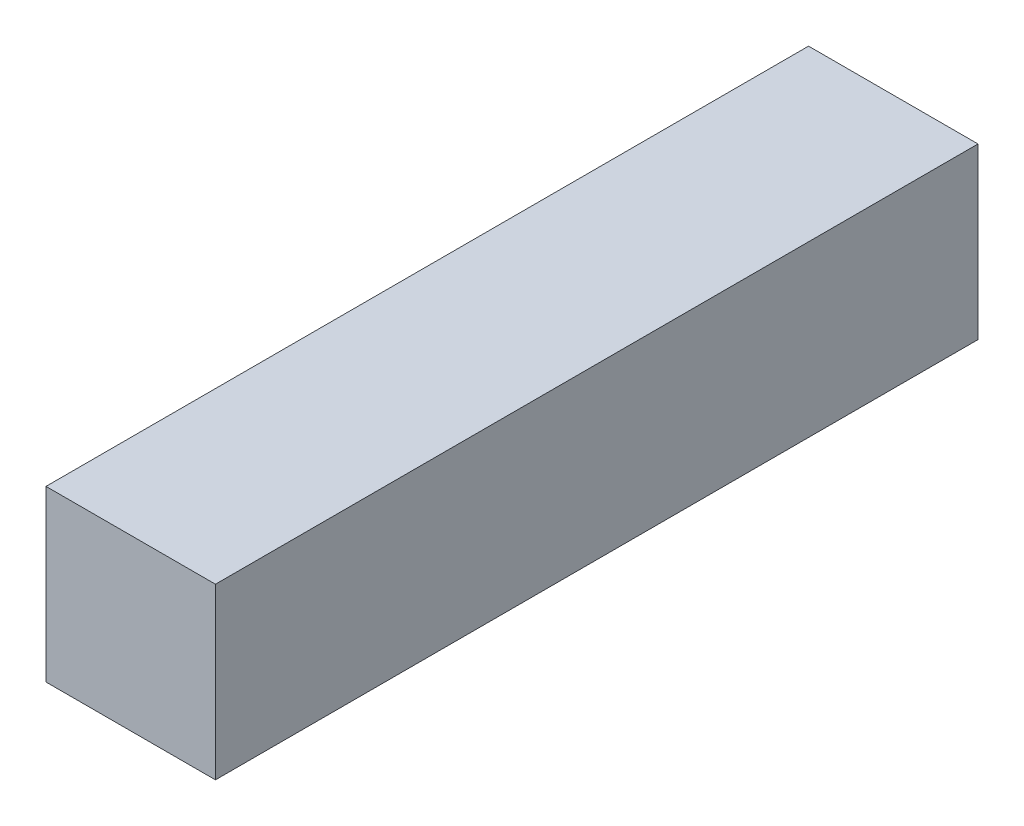
ISO-10303-21;
HEADER;
FILE_DESCRIPTION(('STEP AP214'),'2;1');
FILE_NAME('part.step','',(''),(''),'','','');
FILE_SCHEMA(('AUTOMOTIVE_DESIGN { 1 0 10303 214 1 1 1 1 }'));
ENDSEC;
DATA;
#1=APPLICATION_CONTEXT('core data for automotive mechanical design processes');
#2=APPLICATION_PROTOCOL_DEFINITION('international standard','automotive_design',2000,#1);
#3=PRODUCT_CONTEXT('',#1,'mechanical');
#4=PRODUCT('Part','Part','',(#3));
#5=PRODUCT_RELATED_PRODUCT_CATEGORY('part','',(#4));
#6=PRODUCT_DEFINITION_FORMATION('','',#4);
#7=PRODUCT_DEFINITION_CONTEXT('part definition',#1,'design');
#8=PRODUCT_DEFINITION('design','',#6,#7);
#9=PRODUCT_DEFINITION_SHAPE('','',#8);
#10=(LENGTH_UNIT() NAMED_UNIT(*) SI_UNIT(.MILLI.,.METRE.));
#11=(NAMED_UNIT(*) PLANE_ANGLE_UNIT() SI_UNIT($,.RADIAN.));
#12=(NAMED_UNIT(*) SI_UNIT($,.STERADIAN.) SOLID_ANGLE_UNIT());
#13=UNCERTAINTY_MEASURE_WITH_UNIT(LENGTH_MEASURE(1.E-05),#10,'distance_accuracy_value','');
#14=(GEOMETRIC_REPRESENTATION_CONTEXT(3) GLOBAL_UNCERTAINTY_ASSIGNED_CONTEXT((#13)) GLOBAL_UNIT_ASSIGNED_CONTEXT((#10,
#11,#12)) REPRESENTATION_CONTEXT('',''));
#15=CARTESIAN_POINT('',(0.,0.,0.));
#16=DIRECTION('',(0.,0.,1.));
#17=DIRECTION('',(1.,0.,0.));
#18=AXIS2_PLACEMENT_3D('',#15,#16,#17);
#19=CARTESIAN_POINT('',(-1.5875,-1.5875,7.14375));
#20=DIRECTION('',(1.,0.,0.));
#21=DIRECTION('',(0.,0.,-1.));
#22=AXIS2_PLACEMENT_3D('',#19,#20,#21);
#23=PLANE('',#22);
#24=DIRECTION('',(0.,-1.,0.));
#25=VECTOR('',#24,1.);
#26=CARTESIAN_POINT('',(-1.5875,-1.5875,-7.14375));
#27=LINE('',#26,#25);
#28=CARTESIAN_POINT('',(-1.5875,1.5875,-7.14375));
#29=VERTEX_POINT('',#28);
#30=CARTESIAN_POINT('',(-1.5875,-1.5875,-7.14375));
#31=VERTEX_POINT('',#30);
#32=EDGE_CURVE('E97',#29,#31,#27,.T.);
#33=ORIENTED_EDGE('',*,*,#32,.T.);
#34=DIRECTION('',(0.,0.,-1.));
#35=VECTOR('',#34,1.);
#36=CARTESIAN_POINT('',(-1.5875,-1.5875,7.14375));
#37=LINE('',#36,#35);
#38=CARTESIAN_POINT('',(-1.5875,-1.5875,7.14375));
#39=VERTEX_POINT('',#38);
#40=EDGE_CURVE('E11',#39,#31,#37,.T.);
#41=ORIENTED_EDGE('',*,*,#40,.F.);
#42=DIRECTION('',(0.,-1.,0.));
#43=VECTOR('',#42,1.);
#44=CARTESIAN_POINT('',(-1.5875,-1.5875,7.14375));
#45=LINE('',#44,#43);
#46=CARTESIAN_POINT('',(-1.5875,1.5875,7.14375));
#47=VERTEX_POINT('',#46);
#48=EDGE_CURVE('E85',#47,#39,#45,.T.);
#49=ORIENTED_EDGE('',*,*,#48,.F.);
#50=DIRECTION('',(0.,0.,-1.));
#51=VECTOR('',#50,1.);
#52=CARTESIAN_POINT('',(-1.5875,1.5875,7.14375));
#53=LINE('',#52,#51);
#54=EDGE_CURVE('E93',#47,#29,#53,.T.);
#55=ORIENTED_EDGE('',*,*,#54,.T.);
#56=EDGE_LOOP('',(#33,#41,#49,#55));
#57=FACE_BOUND('',#56,.T.);
#58=ADVANCED_FACE('F34',(#57),#23,.F.);
#59=CARTESIAN_POINT('',(1.5875,-1.5875,7.14375));
#60=DIRECTION('',(0.,1.,0.));
#61=DIRECTION('',(-1.,0.,0.));
#62=AXIS2_PLACEMENT_3D('',#59,#60,#61);
#63=PLANE('',#62);
#64=DIRECTION('',(1.,0.,0.));
#65=VECTOR('',#64,1.);
#66=CARTESIAN_POINT('',(1.5875,-1.5875,-7.14375));
#67=LINE('',#66,#65);
#68=CARTESIAN_POINT('',(1.5875,-1.5875,-7.14375));
#69=VERTEX_POINT('',#68);
#70=EDGE_CURVE('E89',#31,#69,#67,.T.);
#71=ORIENTED_EDGE('',*,*,#70,.T.);
#72=DIRECTION('',(0.,0.,-1.));
#73=VECTOR('',#72,1.);
#74=CARTESIAN_POINT('',(1.5875,-1.5875,7.14375));
#75=LINE('',#74,#73);
#76=CARTESIAN_POINT('',(1.5875,-1.5875,7.14375));
#77=VERTEX_POINT('',#76);
#78=EDGE_CURVE('E42',#77,#69,#75,.T.);
#79=ORIENTED_EDGE('',*,*,#78,.F.);
#80=DIRECTION('',(1.,0.,0.));
#81=VECTOR('',#80,1.);
#82=CARTESIAN_POINT('',(1.5875,-1.5875,7.14375));
#83=LINE('',#82,#81);
#84=EDGE_CURVE('E80',#39,#77,#83,.T.);
#85=ORIENTED_EDGE('',*,*,#84,.F.);
#86=ORIENTED_EDGE('',*,*,#40,.T.);
#87=EDGE_LOOP('',(#71,#79,#85,#86));
#88=FACE_BOUND('',#87,.T.);
#89=ADVANCED_FACE('F88',(#88),#63,.F.);
#90=CARTESIAN_POINT('',(1.5875,-1.5875,7.14375));
#91=DIRECTION('',(-1.,0.,0.));
#92=DIRECTION('',(0.,0.,1.));
#93=AXIS2_PLACEMENT_3D('',#90,#91,#92);
#94=PLANE('',#93);
#95=DIRECTION('',(0.,1.,0.));
#96=VECTOR('',#95,1.);
#97=CARTESIAN_POINT('',(1.5875,-1.5875,-7.14375));
#98=LINE('',#97,#96);
#99=CARTESIAN_POINT('',(1.5875,1.5875,-7.14375));
#100=VERTEX_POINT('',#99);
#101=EDGE_CURVE('E67',#69,#100,#98,.T.);
#102=ORIENTED_EDGE('',*,*,#101,.T.);
#103=DIRECTION('',(0.,0.,-1.));
#104=VECTOR('',#103,1.);
#105=CARTESIAN_POINT('',(1.5875,1.5875,7.14375));
#106=LINE('',#105,#104);
#107=CARTESIAN_POINT('',(1.5875,1.5875,7.14375));
#108=VERTEX_POINT('',#107);
#109=EDGE_CURVE('E90',#108,#100,#106,.T.);
#110=ORIENTED_EDGE('',*,*,#109,.F.);
#111=DIRECTION('',(0.,1.,0.));
#112=VECTOR('',#111,1.);
#113=CARTESIAN_POINT('',(1.5875,-1.5875,7.14375));
#114=LINE('',#113,#112);
#115=EDGE_CURVE('E83',#77,#108,#114,.T.);
#116=ORIENTED_EDGE('',*,*,#115,.F.);
#117=ORIENTED_EDGE('',*,*,#78,.T.);
#118=EDGE_LOOP('',(#102,#110,#116,#117));
#119=FACE_BOUND('',#118,.T.);
#120=ADVANCED_FACE('F91',(#119),#94,.F.);
#121=CARTESIAN_POINT('',(1.5875,1.5875,7.14375));
#122=DIRECTION('',(0.,-1.,0.));
#123=DIRECTION('',(1.,0.,0.));
#124=AXIS2_PLACEMENT_3D('',#121,#122,#123);
#125=PLANE('',#124);
#126=DIRECTION('',(-1.,0.,0.));
#127=VECTOR('',#126,1.);
#128=CARTESIAN_POINT('',(1.5875,1.5875,-7.14375));
#129=LINE('',#128,#127);
#130=EDGE_CURVE('E73',#100,#29,#129,.T.);
#131=ORIENTED_EDGE('',*,*,#130,.T.);
#132=ORIENTED_EDGE('',*,*,#54,.F.);
#133=DIRECTION('',(-1.,0.,0.));
#134=VECTOR('',#133,1.);
#135=CARTESIAN_POINT('',(1.5875,1.5875,7.14375));
#136=LINE('',#135,#134);
#137=EDGE_CURVE('E50',#108,#47,#136,.T.);
#138=ORIENTED_EDGE('',*,*,#137,.F.);
#139=ORIENTED_EDGE('',*,*,#109,.T.);
#140=EDGE_LOOP('',(#131,#132,#138,#139));
#141=FACE_BOUND('',#140,.T.);
#142=ADVANCED_FACE('F104',(#141),#125,.F.);
#143=CARTESIAN_POINT('',(0.,0.,7.14375));
#144=DIRECTION('',(0.,0.,1.));
#145=DIRECTION('',(1.,0.,0.));
#146=AXIS2_PLACEMENT_3D('',#143,#144,#145);
#147=PLANE('',#146);
#148=ORIENTED_EDGE('',*,*,#48,.T.);
#149=ORIENTED_EDGE('',*,*,#84,.T.);
#150=ORIENTED_EDGE('',*,*,#115,.T.);
#151=ORIENTED_EDGE('',*,*,#137,.T.);
#152=EDGE_LOOP('',(#148,#149,#150,#151));
#153=FACE_BOUND('',#152,.T.);
#154=ADVANCED_FACE('F81',(#153),#147,.T.);
#155=CARTESIAN_POINT('',(0.,0.,-7.14375));
#156=DIRECTION('',(0.,0.,1.));
#157=DIRECTION('',(1.,0.,0.));
#158=AXIS2_PLACEMENT_3D('',#155,#156,#157);
#159=PLANE('',#158);
#160=ORIENTED_EDGE('',*,*,#32,.F.);
#161=ORIENTED_EDGE('',*,*,#130,.F.);
#162=ORIENTED_EDGE('',*,*,#101,.F.);
#163=ORIENTED_EDGE('',*,*,#70,.F.);
#164=EDGE_LOOP('',(#160,#161,#162,#163));
#165=FACE_BOUND('',#164,.T.);
#166=ADVANCED_FACE('F107',(#165),#159,.F.);
#167=CLOSED_SHELL('',(#58,#89,#120,#142,#154,#166));
#168=MANIFOLD_SOLID_BREP('B2',#167);
#169=ADVANCED_BREP_SHAPE_REPRESENTATION('',(#18,#168),#14);
#170=SHAPE_DEFINITION_REPRESENTATION(#9,#169);
ENDSEC;
END-ISO-10303-21;
